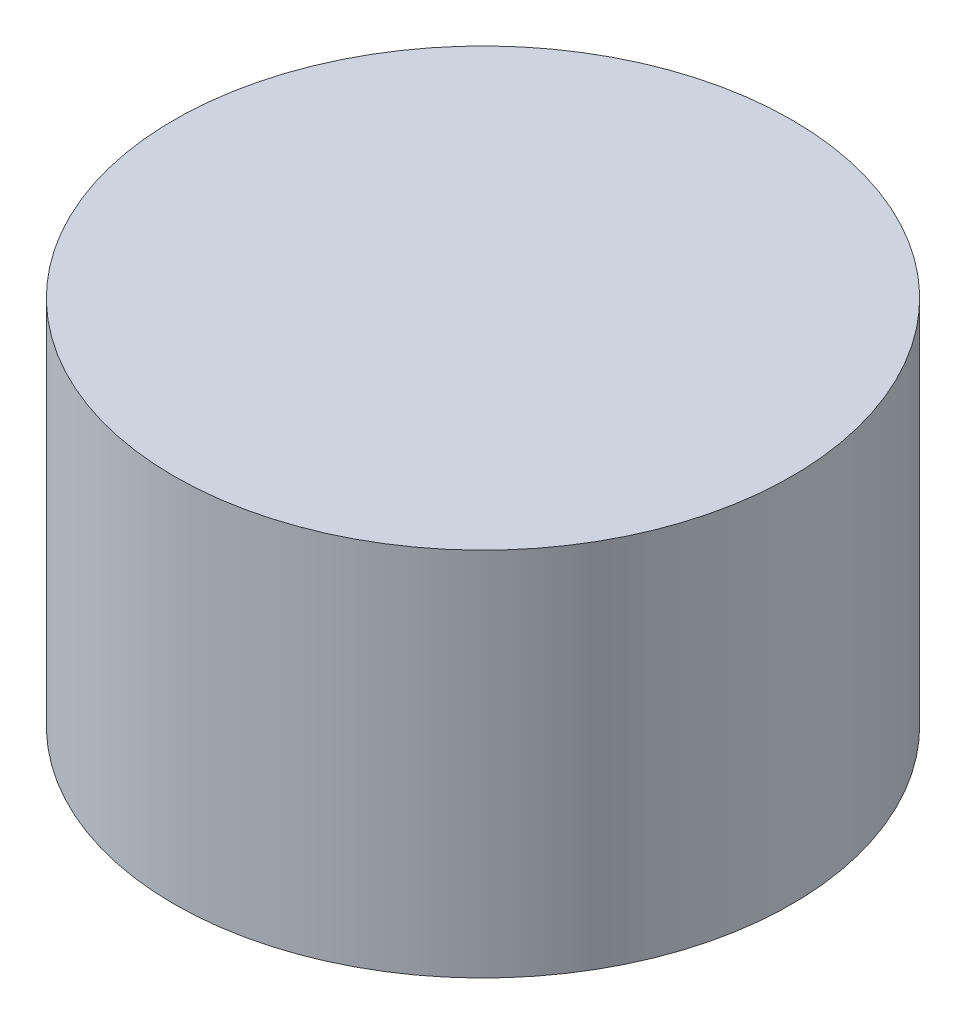
ISO-10303-21;
HEADER;
FILE_DESCRIPTION(('STEP AP214'),'2;1');
FILE_NAME('part.step','',(''),(''),'','','');
FILE_SCHEMA(('AUTOMOTIVE_DESIGN { 1 0 10303 214 1 1 1 1 }'));
ENDSEC;
DATA;
#1=APPLICATION_CONTEXT('core data for automotive mechanical design processes');
#2=APPLICATION_PROTOCOL_DEFINITION('international standard','automotive_design',2000,#1);
#3=PRODUCT_CONTEXT('',#1,'mechanical');
#4=PRODUCT('Part','Part','',(#3));
#5=PRODUCT_RELATED_PRODUCT_CATEGORY('part','',(#4));
#6=PRODUCT_DEFINITION_FORMATION('','',#4);
#7=PRODUCT_DEFINITION_CONTEXT('part definition',#1,'design');
#8=PRODUCT_DEFINITION('design','',#6,#7);
#9=PRODUCT_DEFINITION_SHAPE('','',#8);
#10=(LENGTH_UNIT() NAMED_UNIT(*) SI_UNIT(.MILLI.,.METRE.));
#11=(NAMED_UNIT(*) PLANE_ANGLE_UNIT() SI_UNIT($,.RADIAN.));
#12=(NAMED_UNIT(*) SI_UNIT($,.STERADIAN.) SOLID_ANGLE_UNIT());
#13=UNCERTAINTY_MEASURE_WITH_UNIT(LENGTH_MEASURE(1.E-05),#10,'distance_accuracy_value','');
#14=(GEOMETRIC_REPRESENTATION_CONTEXT(3) GLOBAL_UNCERTAINTY_ASSIGNED_CONTEXT((#13)) GLOBAL_UNIT_ASSIGNED_CONTEXT((#10,
#11,#12)) REPRESENTATION_CONTEXT('',''));
#15=CARTESIAN_POINT('',(0.,0.,0.));
#16=DIRECTION('',(0.,0.,1.));
#17=DIRECTION('',(1.,0.,0.));
#18=AXIS2_PLACEMENT_3D('',#15,#16,#17);
#19=CARTESIAN_POINT('',(-33.2362480014228,3.,-21.4386485200017));
#20=DIRECTION('',(0.,-1.,0.));
#21=DIRECTION('',(0.,0.,-1.));
#22=AXIS2_PLACEMENT_3D('',#19,#20,#21);
#23=CYLINDRICAL_SURFACE('',#22,2.5);
#24=CARTESIAN_POINT('',(-33.2362480014228,3.,-21.4386485200017));
#25=DIRECTION('',(0.,1.,0.));
#26=DIRECTION('',(0.,0.,1.));
#27=AXIS2_PLACEMENT_3D('',#24,#25,#26);
#28=CIRCLE('',#27,2.5);
#29=CARTESIAN_POINT('',(-33.2362480014228,3.,-18.9386485200017));
#30=VERTEX_POINT('',#29);
#31=EDGE_CURVE('E10',#30,#30,#28,.T.);
#32=ORIENTED_EDGE('',*,*,#31,.F.);
#33=EDGE_LOOP('',(#32));
#34=FACE_BOUND('',#33,.T.);
#35=CARTESIAN_POINT('',(-33.2362480014228,0.,-21.4386485200017));
#36=DIRECTION('',(0.,1.,0.));
#37=DIRECTION('',(0.,0.,1.));
#38=AXIS2_PLACEMENT_3D('',#35,#36,#37);
#39=CIRCLE('',#38,2.5);
#40=CARTESIAN_POINT('',(-33.2362480014228,0.,-18.9386485200017));
#41=VERTEX_POINT('',#40);
#42=EDGE_CURVE('E44',#41,#41,#39,.T.);
#43=ORIENTED_EDGE('',*,*,#42,.T.);
#44=EDGE_LOOP('',(#43));
#45=FACE_BOUND('',#44,.T.);
#46=ADVANCED_FACE('F41',(#34,#45),#23,.T.);
#47=CARTESIAN_POINT('',(-33.2362480014228,3.,-21.4386485200017));
#48=DIRECTION('',(0.,1.,0.));
#49=DIRECTION('',(0.,0.,1.));
#50=AXIS2_PLACEMENT_3D('',#47,#48,#49);
#51=PLANE('',#50);
#52=ORIENTED_EDGE('',*,*,#31,.T.);
#53=EDGE_LOOP('',(#52));
#54=FACE_BOUND('',#53,.T.);
#55=ADVANCED_FACE('F58',(#54),#51,.T.);
#56=CARTESIAN_POINT('',(-33.2362480014228,0.,-21.4386485200017));
#57=DIRECTION('',(0.,1.,0.));
#58=DIRECTION('',(0.,0.,1.));
#59=AXIS2_PLACEMENT_3D('',#56,#57,#58);
#60=PLANE('',#59);
#61=ORIENTED_EDGE('',*,*,#42,.F.);
#62=EDGE_LOOP('',(#61));
#63=FACE_BOUND('',#62,.T.);
#64=ADVANCED_FACE('F56',(#63),#60,.F.);
#65=CLOSED_SHELL('',(#46,#55,#64));
#66=MANIFOLD_SOLID_BREP('B2',#65);
#67=ADVANCED_BREP_SHAPE_REPRESENTATION('',(#18,#66),#14);
#68=SHAPE_DEFINITION_REPRESENTATION(#9,#67);
ENDSEC;
END-ISO-10303-21;
